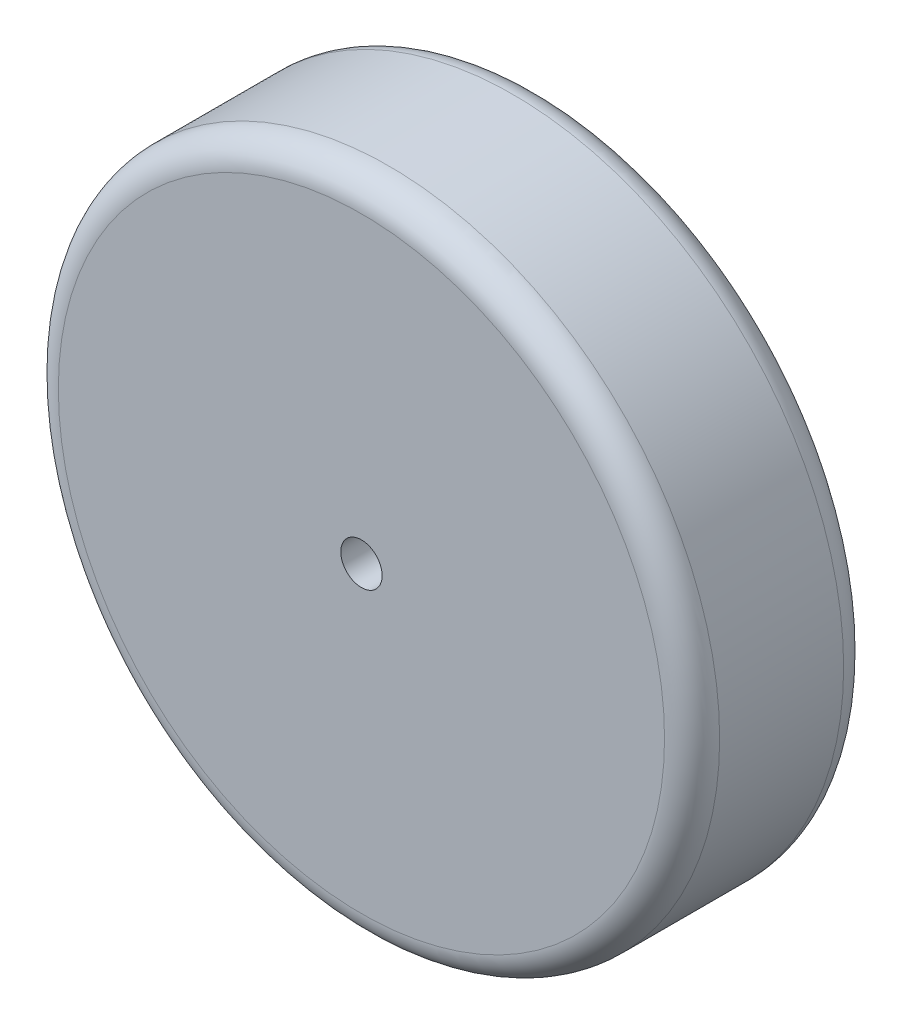
ISO-10303-21;
HEADER;
FILE_DESCRIPTION(('STEP AP214'),'2;1');
FILE_NAME('part.step','',(''),(''),'','','');
FILE_SCHEMA(('AUTOMOTIVE_DESIGN { 1 0 10303 214 1 1 1 1 }'));
ENDSEC;
DATA;
#1=APPLICATION_CONTEXT('core data for automotive mechanical design processes');
#2=APPLICATION_PROTOCOL_DEFINITION('international standard','automotive_design',2000,#1);
#3=PRODUCT_CONTEXT('',#1,'mechanical');
#4=PRODUCT('Part','Part','',(#3));
#5=PRODUCT_RELATED_PRODUCT_CATEGORY('part','',(#4));
#6=PRODUCT_DEFINITION_FORMATION('','',#4);
#7=PRODUCT_DEFINITION_CONTEXT('part definition',#1,'design');
#8=PRODUCT_DEFINITION('design','',#6,#7);
#9=PRODUCT_DEFINITION_SHAPE('','',#8);
#10=(LENGTH_UNIT() NAMED_UNIT(*) SI_UNIT(.MILLI.,.METRE.));
#11=(NAMED_UNIT(*) PLANE_ANGLE_UNIT() SI_UNIT($,.RADIAN.));
#12=(NAMED_UNIT(*) SI_UNIT($,.STERADIAN.) SOLID_ANGLE_UNIT());
#13=UNCERTAINTY_MEASURE_WITH_UNIT(LENGTH_MEASURE(1.E-05),#10,'distance_accuracy_value','');
#14=(GEOMETRIC_REPRESENTATION_CONTEXT(3) GLOBAL_UNCERTAINTY_ASSIGNED_CONTEXT((#13)) GLOBAL_UNIT_ASSIGNED_CONTEXT((#10,
#11,#12)) REPRESENTATION_CONTEXT('',''));
#15=CARTESIAN_POINT('',(0.,0.,0.));
#16=DIRECTION('',(0.,0.,1.));
#17=DIRECTION('',(1.,0.,0.));
#18=AXIS2_PLACEMENT_3D('',#15,#16,#17);
#19=CARTESIAN_POINT('',(-49.2425615355019,14.1936670687575,13.));
#20=DIRECTION('',(0.,0.,1.));
#21=DIRECTION('',(1.,0.,0.));
#22=AXIS2_PLACEMENT_3D('',#19,#20,#21);
#23=PLANE('',#22);
#24=CARTESIAN_POINT('',(-49.2425615355019,14.1936670687575,13.));
#25=DIRECTION('',(0.,0.,1.));
#26=DIRECTION('',(1.,0.,0.));
#27=AXIS2_PLACEMENT_3D('',#24,#25,#26);
#28=CIRCLE('',#27,22.);
#29=CARTESIAN_POINT('',(-27.2425615355019,14.1936670687575,13.));
#30=VERTEX_POINT('',#29);
#31=EDGE_CURVE('E48',#30,#30,#28,.T.);
#32=ORIENTED_EDGE('',*,*,#31,.T.);
#33=EDGE_LOOP('',(#32));
#34=FACE_BOUND('',#33,.T.);
#35=CARTESIAN_POINT('',(-49.2425615355019,14.1936670687575,13.));
#36=DIRECTION('',(0.,0.,1.));
#37=DIRECTION('',(1.,0.,0.));
#38=AXIS2_PLACEMENT_3D('',#35,#36,#37);
#39=CIRCLE('',#38,1.5);
#40=CARTESIAN_POINT('',(-50.7425615355019,14.1936670687575,13.));
#41=VERTEX_POINT('',#40);
#42=EDGE_CURVE('E53',#41,#41,#39,.T.);
#43=ORIENTED_EDGE('',*,*,#42,.F.);
#44=EDGE_LOOP('',(#43));
#45=FACE_BOUND('',#44,.T.);
#46=ADVANCED_FACE('F33',(#34,#45),#23,.T.);
#47=CARTESIAN_POINT('',(-49.2425615355019,14.1936670687575,0.));
#48=DIRECTION('',(0.,0.,1.));
#49=DIRECTION('',(1.,0.,0.));
#50=AXIS2_PLACEMENT_3D('',#47,#48,#49);
#51=PLANE('',#50);
#52=CARTESIAN_POINT('',(-49.2425615355019,14.1936670687575,0.));
#53=DIRECTION('',(0.,0.,1.));
#54=DIRECTION('',(1.,0.,0.));
#55=AXIS2_PLACEMENT_3D('',#52,#53,#54);
#56=CIRCLE('',#55,22.);
#57=CARTESIAN_POINT('',(-27.2425615355019,14.1936670687575,0.));
#58=VERTEX_POINT('',#57);
#59=EDGE_CURVE('E10',#58,#58,#56,.F.);
#60=ORIENTED_EDGE('',*,*,#59,.T.);
#61=EDGE_LOOP('',(#60));
#62=FACE_BOUND('',#61,.T.);
#63=CARTESIAN_POINT('',(-49.2425615355019,14.1936670687575,0.));
#64=DIRECTION('',(0.,0.,1.));
#65=DIRECTION('',(1.,0.,0.));
#66=AXIS2_PLACEMENT_3D('',#63,#64,#65);
#67=CIRCLE('',#66,1.5);
#68=CARTESIAN_POINT('',(-50.7425615355019,14.1936670687575,0.));
#69=VERTEX_POINT('',#68);
#70=EDGE_CURVE('E54',#69,#69,#67,.T.);
#71=ORIENTED_EDGE('',*,*,#70,.T.);
#72=EDGE_LOOP('',(#71));
#73=FACE_BOUND('',#72,.T.);
#74=ADVANCED_FACE('F64',(#62,#73),#51,.F.);
#75=CARTESIAN_POINT('',(-49.2425615355019,14.1936670687575,13.));
#76=DIRECTION('',(0.,0.,-1.));
#77=DIRECTION('',(-1.,0.,0.));
#78=AXIS2_PLACEMENT_3D('',#75,#76,#77);
#79=CYLINDRICAL_SURFACE('',#78,24.);
#80=CARTESIAN_POINT('',(-49.2425615355019,14.1936670687575,2.));
#81=DIRECTION('',(0.,0.,1.));
#82=DIRECTION('',(1.,0.,0.));
#83=AXIS2_PLACEMENT_3D('',#80,#81,#82);
#84=CIRCLE('',#83,24.);
#85=CARTESIAN_POINT('',(-73.2425615355019,14.1936670687575,2.));
#86=VERTEX_POINT('',#85);
#87=EDGE_CURVE('E40',#86,#86,#84,.T.);
#88=CARTESIAN_POINT('',(-49.2425615355019,14.1936670687575,11.));
#89=DIRECTION('',(0.,0.,1.));
#90=DIRECTION('',(1.,0.,0.));
#91=AXIS2_PLACEMENT_3D('',#88,#89,#90);
#92=CIRCLE('',#91,24.);
#93=CARTESIAN_POINT('',(-73.2425615355019,14.1936670687575,11.));
#94=VERTEX_POINT('',#93);
#95=EDGE_CURVE('E44',#94,#94,#92,.F.);
#96=CARTESIAN_POINT('',(-73.2425615355019,14.1936670687575,2.));
#97=CARTESIAN_POINT('',(-73.2425615355019,14.1936670687575,2.09375));
#98=CARTESIAN_POINT('',(-73.2425615355019,14.1936670687575,2.1875));
#99=CARTESIAN_POINT('',(-73.2425615355019,14.1936670687575,2.375));
#100=CARTESIAN_POINT('',(-73.2425615355019,14.1936670687575,2.46875));
#101=CARTESIAN_POINT('',(-73.2425615355019,14.1936670687575,2.65625));
#102=CARTESIAN_POINT('',(-73.2425615355019,14.1936670687575,2.75));
#103=CARTESIAN_POINT('',(-73.2425615355019,14.1936670687575,2.9375));
#104=CARTESIAN_POINT('',(-73.2425615355019,14.1936670687575,3.03125));
#105=CARTESIAN_POINT('',(-73.2425615355019,14.1936670687575,3.21875));
#106=CARTESIAN_POINT('',(-73.2425615355019,14.1936670687575,3.3125));
#107=CARTESIAN_POINT('',(-73.2425615355019,14.1936670687575,3.5));
#108=CARTESIAN_POINT('',(-73.2425615355019,14.1936670687575,3.59375));
#109=CARTESIAN_POINT('',(-73.2425615355019,14.1936670687575,3.78125));
#110=CARTESIAN_POINT('',(-73.2425615355019,14.1936670687575,3.875));
#111=CARTESIAN_POINT('',(-73.2425615355019,14.1936670687575,4.0625));
#112=CARTESIAN_POINT('',(-73.2425615355019,14.1936670687575,4.15625));
#113=CARTESIAN_POINT('',(-73.2425615355019,14.1936670687575,4.34375));
#114=CARTESIAN_POINT('',(-73.2425615355019,14.1936670687575,4.4375));
#115=CARTESIAN_POINT('',(-73.2425615355019,14.1936670687575,4.625));
#116=CARTESIAN_POINT('',(-73.2425615355019,14.1936670687575,4.71875));
#117=CARTESIAN_POINT('',(-73.2425615355019,14.1936670687575,4.90625));
#118=CARTESIAN_POINT('',(-73.2425615355019,14.1936670687575,5.));
#119=CARTESIAN_POINT('',(-73.2425615355019,14.1936670687575,5.1875));
#120=CARTESIAN_POINT('',(-73.2425615355019,14.1936670687575,5.28125));
#121=CARTESIAN_POINT('',(-73.2425615355019,14.1936670687575,5.46875));
#122=CARTESIAN_POINT('',(-73.2425615355019,14.1936670687575,5.5625));
#123=CARTESIAN_POINT('',(-73.2425615355019,14.1936670687575,5.75));
#124=CARTESIAN_POINT('',(-73.2425615355019,14.1936670687575,5.84375));
#125=CARTESIAN_POINT('',(-73.2425615355019,14.1936670687575,6.03125));
#126=CARTESIAN_POINT('',(-73.2425615355019,14.1936670687575,6.125));
#127=CARTESIAN_POINT('',(-73.2425615355019,14.1936670687575,6.3125));
#128=CARTESIAN_POINT('',(-73.2425615355019,14.1936670687575,6.40625));
#129=CARTESIAN_POINT('',(-73.2425615355019,14.1936670687575,6.59375));
#130=CARTESIAN_POINT('',(-73.2425615355019,14.1936670687575,6.6875));
#131=CARTESIAN_POINT('',(-73.2425615355019,14.1936670687575,6.875));
#132=CARTESIAN_POINT('',(-73.2425615355019,14.1936670687575,6.96875));
#133=CARTESIAN_POINT('',(-73.2425615355019,14.1936670687575,7.15625));
#134=CARTESIAN_POINT('',(-73.2425615355019,14.1936670687575,7.25));
#135=CARTESIAN_POINT('',(-73.2425615355019,14.1936670687575,7.4375));
#136=CARTESIAN_POINT('',(-73.2425615355019,14.1936670687575,7.53125));
#137=CARTESIAN_POINT('',(-73.2425615355019,14.1936670687575,7.71875));
#138=CARTESIAN_POINT('',(-73.2425615355019,14.1936670687575,7.8125));
#139=CARTESIAN_POINT('',(-73.2425615355019,14.1936670687575,8.));
#140=CARTESIAN_POINT('',(-73.2425615355019,14.1936670687575,8.09375));
#141=CARTESIAN_POINT('',(-73.2425615355019,14.1936670687575,8.28125));
#142=CARTESIAN_POINT('',(-73.2425615355019,14.1936670687575,8.375));
#143=CARTESIAN_POINT('',(-73.2425615355019,14.1936670687575,8.5625));
#144=CARTESIAN_POINT('',(-73.2425615355019,14.1936670687575,8.65625));
#145=CARTESIAN_POINT('',(-73.2425615355019,14.1936670687575,8.84375));
#146=CARTESIAN_POINT('',(-73.2425615355019,14.1936670687575,8.9375));
#147=CARTESIAN_POINT('',(-73.2425615355019,14.1936670687575,9.125));
#148=CARTESIAN_POINT('',(-73.2425615355019,14.1936670687575,9.21875));
#149=CARTESIAN_POINT('',(-73.2425615355019,14.1936670687575,9.40625));
#150=CARTESIAN_POINT('',(-73.2425615355019,14.1936670687575,9.5));
#151=CARTESIAN_POINT('',(-73.2425615355019,14.1936670687575,9.6875));
#152=CARTESIAN_POINT('',(-73.2425615355019,14.1936670687575,9.78125));
#153=CARTESIAN_POINT('',(-73.2425615355019,14.1936670687575,9.96875));
#154=CARTESIAN_POINT('',(-73.2425615355019,14.1936670687575,10.0625));
#155=CARTESIAN_POINT('',(-73.2425615355019,14.1936670687575,10.25));
#156=CARTESIAN_POINT('',(-73.2425615355019,14.1936670687575,10.34375));
#157=CARTESIAN_POINT('',(-73.2425615355019,14.1936670687575,10.53125));
#158=CARTESIAN_POINT('',(-73.2425615355019,14.1936670687575,10.625));
#159=CARTESIAN_POINT('',(-73.2425615355019,14.1936670687575,10.8125));
#160=CARTESIAN_POINT('',(-73.2425615355019,14.1936670687575,10.90625));
#161=CARTESIAN_POINT('',(-73.2425615355019,14.1936670687575,11.));
#162=B_SPLINE_CURVE_WITH_KNOTS('',3,(#96,#97,#98,#99,#100,#101,#102,#103,#104,#105,#106,#107,
#108,#109,#110,#111,#112,#113,#114,#115,#116,#117,#118,#119,#120,#121,#122,#123,#124,#125,#126,
#127,#128,#129,#130,#131,#132,#133,#134,#135,#136,#137,#138,#139,#140,#141,#142,#143,#144,#145,
#146,#147,#148,#149,#150,#151,#152,#153,#154,#155,#156,#157,#158,#159,#160,#161),.UNSPECIFIED.,
.F.,.F.,(4,2,2,2,2,2,2,2,2,2,2,2,2,2,2,2,2,2,2,2,2,2,2,2,2,2,2,2,2,2,2,2,4),(0.,0.28125,0.5625,
0.843750000000001,1.125,1.40625,1.6875,1.96875,2.25,2.53125,2.8125,3.09375,3.375,3.65625,3.9375,
4.21875,4.5,4.78125,5.0625,5.34375,5.625,5.90625,6.1875,6.46875,6.75,7.03125,7.3125,7.59375,
7.875,8.15625,8.4375,8.71875,9.),.UNSPECIFIED.);
#163=EDGE_CURVE('BSEAM70',#86,#94,#162,.T.);
#164=ORIENTED_EDGE('',*,*,#87,.T.);
#165=ORIENTED_EDGE('',*,*,#95,.T.);
#166=ORIENTED_EDGE('',*,*,#163,.T.);
#167=ORIENTED_EDGE('',*,*,#163,.F.);
#168=EDGE_LOOP('',(#164,#166,#165,#167));
#169=FACE_BOUND('',#168,.T.);
#170=ADVANCED_FACE('F70',(#169),#79,.T.);
#171=CARTESIAN_POINT('',(-49.2425615355019,14.1936670687575,13.));
#172=DIRECTION('',(0.,0.,-1.));
#173=DIRECTION('',(-1.,0.,0.));
#174=AXIS2_PLACEMENT_3D('',#171,#172,#173);
#175=CYLINDRICAL_SURFACE('',#174,1.5);
#176=CARTESIAN_POINT('',(-50.7425615355019,14.1936670687575,13.));
#177=CARTESIAN_POINT('',(-50.7425615355019,14.1936670687575,12.8645833333333));
#178=CARTESIAN_POINT('',(-50.7425615355019,14.1936670687575,12.7291666666667));
#179=CARTESIAN_POINT('',(-50.7425615355019,14.1936670687575,12.4583333333333));
#180=CARTESIAN_POINT('',(-50.7425615355019,14.1936670687575,12.3229166666667));
#181=CARTESIAN_POINT('',(-50.7425615355019,14.1936670687575,12.0520833333333));
#182=CARTESIAN_POINT('',(-50.7425615355019,14.1936670687575,11.9166666666667));
#183=CARTESIAN_POINT('',(-50.7425615355019,14.1936670687575,11.6458333333333));
#184=CARTESIAN_POINT('',(-50.7425615355019,14.1936670687575,11.5104166666667));
#185=CARTESIAN_POINT('',(-50.7425615355019,14.1936670687575,11.2395833333333));
#186=CARTESIAN_POINT('',(-50.7425615355019,14.1936670687575,11.1041666666667));
#187=CARTESIAN_POINT('',(-50.7425615355019,14.1936670687575,10.8333333333333));
#188=CARTESIAN_POINT('',(-50.7425615355019,14.1936670687575,10.6979166666667));
#189=CARTESIAN_POINT('',(-50.7425615355019,14.1936670687575,10.4270833333333));
#190=CARTESIAN_POINT('',(-50.7425615355019,14.1936670687575,10.2916666666667));
#191=CARTESIAN_POINT('',(-50.7425615355019,14.1936670687575,10.0208333333333));
#192=CARTESIAN_POINT('',(-50.7425615355019,14.1936670687575,9.88541666666667));
#193=CARTESIAN_POINT('',(-50.7425615355019,14.1936670687575,9.61458333333333));
#194=CARTESIAN_POINT('',(-50.7425615355019,14.1936670687575,9.47916666666667));
#195=CARTESIAN_POINT('',(-50.7425615355019,14.1936670687575,9.20833333333333));
#196=CARTESIAN_POINT('',(-50.7425615355019,14.1936670687575,9.07291666666666));
#197=CARTESIAN_POINT('',(-50.7425615355019,14.1936670687575,8.80208333333333));
#198=CARTESIAN_POINT('',(-50.7425615355019,14.1936670687575,8.66666666666667));
#199=CARTESIAN_POINT('',(-50.7425615355019,14.1936670687575,8.39583333333333));
#200=CARTESIAN_POINT('',(-50.7425615355019,14.1936670687575,8.26041666666667));
#201=CARTESIAN_POINT('',(-50.7425615355019,14.1936670687575,7.98958333333333));
#202=CARTESIAN_POINT('',(-50.7425615355019,14.1936670687575,7.85416666666667));
#203=CARTESIAN_POINT('',(-50.7425615355019,14.1936670687575,7.58333333333333));
#204=CARTESIAN_POINT('',(-50.7425615355019,14.1936670687575,7.44791666666667));
#205=CARTESIAN_POINT('',(-50.7425615355019,14.1936670687575,7.17708333333333));
#206=CARTESIAN_POINT('',(-50.7425615355019,14.1936670687575,7.04166666666667));
#207=CARTESIAN_POINT('',(-50.7425615355019,14.1936670687575,6.77083333333333));
#208=CARTESIAN_POINT('',(-50.7425615355019,14.1936670687575,6.63541666666667));
#209=CARTESIAN_POINT('',(-50.7425615355019,14.1936670687575,6.36458333333333));
#210=CARTESIAN_POINT('',(-50.7425615355019,14.1936670687575,6.22916666666667));
#211=CARTESIAN_POINT('',(-50.7425615355019,14.1936670687575,5.95833333333333));
#212=CARTESIAN_POINT('',(-50.7425615355019,14.1936670687575,5.82291666666667));
#213=CARTESIAN_POINT('',(-50.7425615355019,14.1936670687575,5.55208333333333));
#214=CARTESIAN_POINT('',(-50.7425615355019,14.1936670687575,5.41666666666667));
#215=CARTESIAN_POINT('',(-50.7425615355019,14.1936670687575,5.14583333333333));
#216=CARTESIAN_POINT('',(-50.7425615355019,14.1936670687575,5.01041666666667));
#217=CARTESIAN_POINT('',(-50.7425615355019,14.1936670687575,4.73958333333333));
#218=CARTESIAN_POINT('',(-50.7425615355019,14.1936670687575,4.60416666666667));
#219=CARTESIAN_POINT('',(-50.7425615355019,14.1936670687575,4.33333333333333));
#220=CARTESIAN_POINT('',(-50.7425615355019,14.1936670687575,4.19791666666667));
#221=CARTESIAN_POINT('',(-50.7425615355019,14.1936670687575,3.92708333333333));
#222=CARTESIAN_POINT('',(-50.7425615355019,14.1936670687575,3.79166666666667));
#223=CARTESIAN_POINT('',(-50.7425615355019,14.1936670687575,3.52083333333333));
#224=CARTESIAN_POINT('',(-50.7425615355019,14.1936670687575,3.38541666666667));
#225=CARTESIAN_POINT('',(-50.7425615355019,14.1936670687575,3.11458333333333));
#226=CARTESIAN_POINT('',(-50.7425615355019,14.1936670687575,2.97916666666667));
#227=CARTESIAN_POINT('',(-50.7425615355019,14.1936670687575,2.70833333333333));
#228=CARTESIAN_POINT('',(-50.7425615355019,14.1936670687575,2.57291666666667));
#229=CARTESIAN_POINT('',(-50.7425615355019,14.1936670687575,2.30208333333333));
#230=CARTESIAN_POINT('',(-50.7425615355019,14.1936670687575,2.16666666666667));
#231=CARTESIAN_POINT('',(-50.7425615355019,14.1936670687575,1.89583333333333));
#232=CARTESIAN_POINT('',(-50.7425615355019,14.1936670687575,1.76041666666667));
#233=CARTESIAN_POINT('',(-50.7425615355019,14.1936670687575,1.48958333333333));
#234=CARTESIAN_POINT('',(-50.7425615355019,14.1936670687575,1.35416666666667));
#235=CARTESIAN_POINT('',(-50.7425615355019,14.1936670687575,1.08333333333333));
#236=CARTESIAN_POINT('',(-50.7425615355019,14.1936670687575,0.947916666666667));
#237=CARTESIAN_POINT('',(-50.7425615355019,14.1936670687575,0.677083333333334));
#238=CARTESIAN_POINT('',(-50.7425615355019,14.1936670687575,0.541666666666667));
#239=CARTESIAN_POINT('',(-50.7425615355019,14.1936670687575,0.270833333333334));
#240=CARTESIAN_POINT('',(-50.7425615355019,14.1936670687575,0.135416666666667));
#241=CARTESIAN_POINT('',(-50.7425615355019,14.1936670687575,0.));
#242=B_SPLINE_CURVE_WITH_KNOTS('',3,(#176,#177,#178,#179,#180,#181,#182,#183,#184,#185,#186,
#187,#188,#189,#190,#191,#192,#193,#194,#195,#196,#197,#198,#199,#200,#201,#202,#203,#204,#205,
#206,#207,#208,#209,#210,#211,#212,#213,#214,#215,#216,#217,#218,#219,#220,#221,#222,#223,#224,
#225,#226,#227,#228,#229,#230,#231,#232,#233,#234,#235,#236,#237,#238,#239,#240,#241),
.UNSPECIFIED.,.F.,.F.,(4,2,2,2,2,2,2,2,2,2,2,2,2,2,2,2,2,2,2,2,2,2,2,2,2,2,2,2,2,2,2,2,4),(0.,
0.40625,0.812500000000001,1.21875,1.625,2.03125,2.4375,2.84375,3.25,3.65625,4.0625,4.46875,
4.875,5.28125,5.6875,6.09375,6.5,6.90625,7.3125,7.71875,8.125,8.53125,8.9375,9.34375,9.75,
10.15625,10.5625,10.96875,11.375,11.78125,12.1875,12.59375,13.),.UNSPECIFIED.);
#243=EDGE_CURVE('BSEAM60',#41,#69,#242,.T.);
#244=ORIENTED_EDGE('',*,*,#42,.T.);
#245=ORIENTED_EDGE('',*,*,#70,.F.);
#246=ORIENTED_EDGE('',*,*,#243,.T.);
#247=ORIENTED_EDGE('',*,*,#243,.F.);
#248=EDGE_LOOP('',(#244,#246,#245,#247));
#249=FACE_BOUND('',#248,.T.);
#250=ADVANCED_FACE('F60',(#249),#175,.F.);
#251=CARTESIAN_POINT('',(-49.2425615355019,14.1936670687575,11.));
#252=DIRECTION('',(0.,0.,1.));
#253=DIRECTION('',(1.,0.,0.));
#254=AXIS2_PLACEMENT_3D('',#251,#252,#253);
#255=TOROIDAL_SURFACE('',#254,22.,2.);
#256=ORIENTED_EDGE('',*,*,#95,.F.);
#257=EDGE_LOOP('',(#256));
#258=FACE_BOUND('',#257,.T.);
#259=ORIENTED_EDGE('',*,*,#31,.F.);
#260=EDGE_LOOP('',(#259));
#261=FACE_BOUND('',#260,.T.);
#262=ADVANCED_FACE('F75',(#258,#261),#255,.T.);
#263=CARTESIAN_POINT('',(-49.2425615355019,14.1936670687575,2.));
#264=DIRECTION('',(0.,0.,1.));
#265=DIRECTION('',(1.,0.,0.));
#266=AXIS2_PLACEMENT_3D('',#263,#264,#265);
#267=TOROIDAL_SURFACE('',#266,22.,2.);
#268=ORIENTED_EDGE('',*,*,#59,.F.);
#269=EDGE_LOOP('',(#268));
#270=FACE_BOUND('',#269,.T.);
#271=ORIENTED_EDGE('',*,*,#87,.F.);
#272=EDGE_LOOP('',(#271));
#273=FACE_BOUND('',#272,.T.);
#274=ADVANCED_FACE('F35',(#270,#273),#267,.T.);
#275=CLOSED_SHELL('',(#46,#74,#170,#250,#262,#274));
#276=MANIFOLD_SOLID_BREP('B2',#275);
#277=ADVANCED_BREP_SHAPE_REPRESENTATION('',(#18,#276),#14);
#278=SHAPE_DEFINITION_REPRESENTATION(#9,#277);
ENDSEC;
END-ISO-10303-21;
